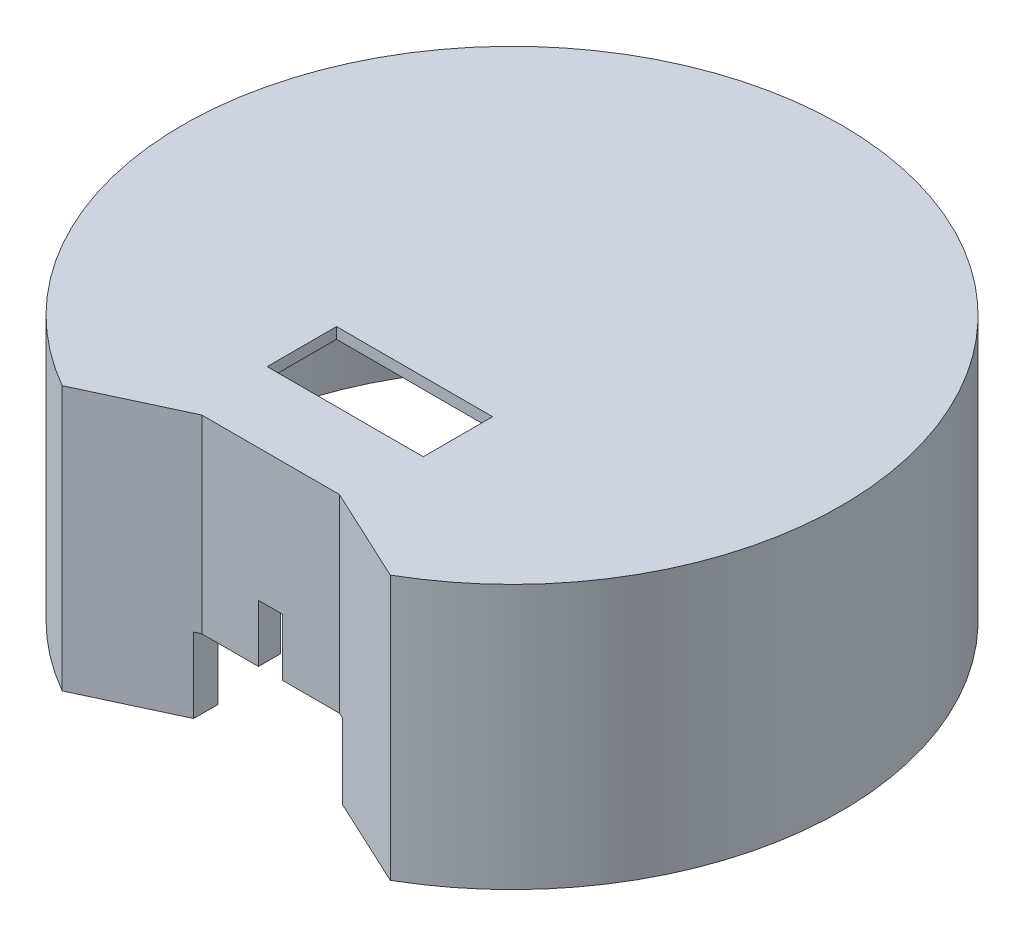
ISO-10303-21;
HEADER;
FILE_DESCRIPTION(('STEP AP214'),'2;1');
FILE_NAME('part.step','',(''),(''),'','','');
FILE_SCHEMA(('AUTOMOTIVE_DESIGN { 1 0 10303 214 1 1 1 1 }'));
ENDSEC;
DATA;
#1=APPLICATION_CONTEXT('core data for automotive mechanical design processes');
#2=APPLICATION_PROTOCOL_DEFINITION('international standard','automotive_design',2000,#1);
#3=PRODUCT_CONTEXT('',#1,'mechanical');
#4=PRODUCT('Part','Part','',(#3));
#5=PRODUCT_RELATED_PRODUCT_CATEGORY('part','',(#4));
#6=PRODUCT_DEFINITION_FORMATION('','',#4);
#7=PRODUCT_DEFINITION_CONTEXT('part definition',#1,'design');
#8=PRODUCT_DEFINITION('design','',#6,#7);
#9=PRODUCT_DEFINITION_SHAPE('','',#8);
#10=(LENGTH_UNIT() NAMED_UNIT(*) SI_UNIT(.MILLI.,.METRE.));
#11=(NAMED_UNIT(*) PLANE_ANGLE_UNIT() SI_UNIT($,.RADIAN.));
#12=(NAMED_UNIT(*) SI_UNIT($,.STERADIAN.) SOLID_ANGLE_UNIT());
#13=UNCERTAINTY_MEASURE_WITH_UNIT(LENGTH_MEASURE(1.E-05),#10,'distance_accuracy_value','');
#14=(GEOMETRIC_REPRESENTATION_CONTEXT(3) GLOBAL_UNCERTAINTY_ASSIGNED_CONTEXT((#13)) GLOBAL_UNIT_ASSIGNED_CONTEXT((#10,
#11,#12)) REPRESENTATION_CONTEXT('',''));
#15=CARTESIAN_POINT('',(0.,0.,0.));
#16=DIRECTION('',(0.,0.,1.));
#17=DIRECTION('',(1.,0.,0.));
#18=AXIS2_PLACEMENT_3D('',#15,#16,#17);
#19=CARTESIAN_POINT('',(-45.,0.,96.2));
#20=DIRECTION('',(-1.,0.,0.));
#21=DIRECTION('',(0.,0.,1.));
#22=AXIS2_PLACEMENT_3D('',#19,#20,#21);
#23=PLANE('',#22);
#24=DIRECTION('',(0.,0.,1.));
#25=VECTOR('',#24,1.);
#26=CARTESIAN_POINT('',(-45.,146.05,0.));
#27=LINE('',#26,#25);
#28=CARTESIAN_POINT('',(-45.,146.05,56.2));
#29=VERTEX_POINT('',#28);
#30=CARTESIAN_POINT('',(-45.,146.05,96.2));
#31=VERTEX_POINT('',#30);
#32=EDGE_CURVE('E54',#29,#31,#27,.T.);
#33=ORIENTED_EDGE('',*,*,#32,.F.);
#34=DIRECTION('',(0.,1.,0.));
#35=VECTOR('',#34,1.);
#36=CARTESIAN_POINT('',(-45.,0.,56.2));
#37=LINE('',#36,#35);
#38=CARTESIAN_POINT('',(-45.,152.4,56.2));
#39=VERTEX_POINT('',#38);
#40=EDGE_CURVE('E241',#29,#39,#37,.T.);
#41=ORIENTED_EDGE('',*,*,#40,.T.);
#42=DIRECTION('',(0.,0.,-1.));
#43=VECTOR('',#42,1.);
#44=CARTESIAN_POINT('',(-45.,152.4,0.));
#45=LINE('',#44,#43);
#46=CARTESIAN_POINT('',(-45.,152.4,96.2));
#47=VERTEX_POINT('',#46);
#48=EDGE_CURVE('E257',#47,#39,#45,.T.);
#49=ORIENTED_EDGE('',*,*,#48,.F.);
#50=DIRECTION('',(0.,1.,0.));
#51=VECTOR('',#50,1.);
#52=CARTESIAN_POINT('',(-45.,0.,96.2));
#53=LINE('',#52,#51);
#54=EDGE_CURVE('E234',#31,#47,#53,.T.);
#55=ORIENTED_EDGE('',*,*,#54,.F.);
#56=EDGE_LOOP('',(#33,#41,#49,#55));
#57=FACE_BOUND('',#56,.T.);
#58=ADVANCED_FACE('F39',(#57),#23,.F.);
#59=CARTESIAN_POINT('',(-45.,0.,56.2));
#60=DIRECTION('',(0.,0.,-1.));
#61=DIRECTION('',(-1.,0.,0.));
#62=AXIS2_PLACEMENT_3D('',#59,#60,#61);
#63=PLANE('',#62);
#64=DIRECTION('',(-1.,0.,0.));
#65=VECTOR('',#64,1.);
#66=CARTESIAN_POINT('',(0.,146.05,56.2));
#67=LINE('',#66,#65);
#68=CARTESIAN_POINT('',(45.,146.05,56.2));
#69=VERTEX_POINT('',#68);
#70=EDGE_CURVE('E211',#69,#29,#67,.T.);
#71=ORIENTED_EDGE('',*,*,#70,.F.);
#72=DIRECTION('',(0.,1.,0.));
#73=VECTOR('',#72,1.);
#74=CARTESIAN_POINT('',(45.,0.,56.2));
#75=LINE('',#74,#73);
#76=CARTESIAN_POINT('',(45.,152.4,56.2));
#77=VERTEX_POINT('',#76);
#78=EDGE_CURVE('E244',#69,#77,#75,.T.);
#79=ORIENTED_EDGE('',*,*,#78,.T.);
#80=DIRECTION('',(1.,0.,0.));
#81=VECTOR('',#80,1.);
#82=CARTESIAN_POINT('',(0.,152.4,56.2));
#83=LINE('',#82,#81);
#84=EDGE_CURVE('E254',#39,#77,#83,.T.);
#85=ORIENTED_EDGE('',*,*,#84,.F.);
#86=ORIENTED_EDGE('',*,*,#40,.F.);
#87=EDGE_LOOP('',(#71,#79,#85,#86));
#88=FACE_BOUND('',#87,.T.);
#89=ADVANCED_FACE('F377',(#88),#63,.F.);
#90=CARTESIAN_POINT('',(45.,0.,96.2));
#91=DIRECTION('',(1.,0.,0.));
#92=DIRECTION('',(0.,0.,-1.));
#93=AXIS2_PLACEMENT_3D('',#90,#91,#92);
#94=PLANE('',#93);
#95=DIRECTION('',(0.,0.,-1.));
#96=VECTOR('',#95,1.);
#97=CARTESIAN_POINT('',(45.,146.05,0.));
#98=LINE('',#97,#96);
#99=CARTESIAN_POINT('',(45.,146.05,96.2));
#100=VERTEX_POINT('',#99);
#101=EDGE_CURVE('E216',#100,#69,#98,.T.);
#102=ORIENTED_EDGE('',*,*,#101,.F.);
#103=DIRECTION('',(0.,1.,0.));
#104=VECTOR('',#103,1.);
#105=CARTESIAN_POINT('',(45.,0.,96.2));
#106=LINE('',#105,#104);
#107=CARTESIAN_POINT('',(45.,152.4,96.2));
#108=VERTEX_POINT('',#107);
#109=EDGE_CURVE('E246',#100,#108,#106,.T.);
#110=ORIENTED_EDGE('',*,*,#109,.T.);
#111=DIRECTION('',(0.,0.,1.));
#112=VECTOR('',#111,1.);
#113=CARTESIAN_POINT('',(45.,152.4,0.));
#114=LINE('',#113,#112);
#115=EDGE_CURVE('E251',#77,#108,#114,.T.);
#116=ORIENTED_EDGE('',*,*,#115,.F.);
#117=ORIENTED_EDGE('',*,*,#78,.F.);
#118=EDGE_LOOP('',(#102,#110,#116,#117));
#119=FACE_BOUND('',#118,.T.);
#120=ADVANCED_FACE('F383',(#119),#94,.F.);
#121=CARTESIAN_POINT('',(-45.,0.,96.2));
#122=DIRECTION('',(0.,0.,1.));
#123=DIRECTION('',(1.,0.,0.));
#124=AXIS2_PLACEMENT_3D('',#121,#122,#123);
#125=PLANE('',#124);
#126=DIRECTION('',(1.,0.,0.));
#127=VECTOR('',#126,1.);
#128=CARTESIAN_POINT('',(0.,146.05,96.2));
#129=LINE('',#128,#127);
#130=EDGE_CURVE('E214',#31,#100,#129,.T.);
#131=ORIENTED_EDGE('',*,*,#130,.F.);
#132=ORIENTED_EDGE('',*,*,#54,.T.);
#133=DIRECTION('',(-1.,0.,0.));
#134=VECTOR('',#133,1.);
#135=CARTESIAN_POINT('',(0.,152.4,96.2));
#136=LINE('',#135,#134);
#137=EDGE_CURVE('E243',#108,#47,#136,.T.);
#138=ORIENTED_EDGE('',*,*,#137,.F.);
#139=ORIENTED_EDGE('',*,*,#109,.F.);
#140=EDGE_LOOP('',(#131,#132,#138,#139));
#141=FACE_BOUND('',#140,.T.);
#142=ADVANCED_FACE('F388',(#141),#125,.F.);
#143=CARTESIAN_POINT('',(-39.6875000000003,152.4,139.2));
#144=DIRECTION('',(0.,0.,-1.));
#145=DIRECTION('',(-1.,0.,0.));
#146=AXIS2_PLACEMENT_3D('',#143,#144,#145);
#147=PLANE('',#146);
#148=DIRECTION('',(0.,-1.,0.));
#149=VECTOR('',#148,1.);
#150=CARTESIAN_POINT('',(6.98499999999998,0.,139.2));
#151=LINE('',#150,#149);
#152=CARTESIAN_POINT('',(6.985,76.2,139.2));
#153=VERTEX_POINT('',#152);
#154=CARTESIAN_POINT('',(6.98499999999999,43.175,139.2));
#155=VERTEX_POINT('',#154);
#156=EDGE_CURVE('E225',#153,#155,#151,.T.);
#157=ORIENTED_EDGE('',*,*,#156,.T.);
#158=DIRECTION('',(-1.,0.,0.));
#159=VECTOR('',#158,1.);
#160=CARTESIAN_POINT('',(39.6874999999997,43.175,139.2));
#161=LINE('',#160,#159);
#162=CARTESIAN_POINT('',(39.6874999999997,43.175,139.2));
#163=VERTEX_POINT('',#162);
#164=EDGE_CURVE('E275',#163,#155,#161,.T.);
#165=ORIENTED_EDGE('',*,*,#164,.F.);
#166=DIRECTION('',(0.,-1.,0.));
#167=VECTOR('',#166,1.);
#168=CARTESIAN_POINT('',(39.6874999999997,152.4,139.2));
#169=LINE('',#168,#167);
#170=CARTESIAN_POINT('',(39.6874999999997,152.4,139.2));
#171=VERTEX_POINT('',#170);
#172=EDGE_CURVE('E47',#171,#163,#169,.T.);
#173=ORIENTED_EDGE('',*,*,#172,.F.);
#174=DIRECTION('',(1.,0.,0.));
#175=VECTOR('',#174,1.);
#176=CARTESIAN_POINT('',(-39.6875000000003,152.4,139.2));
#177=LINE('',#176,#175);
#178=CARTESIAN_POINT('',(-39.6875000000003,152.4,139.2));
#179=VERTEX_POINT('',#178);
#180=EDGE_CURVE('E310',#179,#171,#177,.T.);
#181=ORIENTED_EDGE('',*,*,#180,.F.);
#182=DIRECTION('',(0.,-1.,0.));
#183=VECTOR('',#182,1.);
#184=CARTESIAN_POINT('',(-39.6875000000003,152.4,139.2));
#185=LINE('',#184,#183);
#186=CARTESIAN_POINT('',(-39.6875000000003,43.175,139.2));
#187=VERTEX_POINT('',#186);
#188=EDGE_CURVE('E11',#179,#187,#185,.T.);
#189=ORIENTED_EDGE('',*,*,#188,.T.);
#190=CARTESIAN_POINT('',(-6.98499999999998,43.175,139.2));
#191=VERTEX_POINT('',#190);
#192=EDGE_CURVE('E274',#191,#187,#161,.T.);
#193=ORIENTED_EDGE('',*,*,#192,.F.);
#194=DIRECTION('',(0.,-1.,0.));
#195=VECTOR('',#194,1.);
#196=CARTESIAN_POINT('',(-6.98499999999998,0.,139.2));
#197=LINE('',#196,#195);
#198=CARTESIAN_POINT('',(-6.985,76.2,139.2));
#199=VERTEX_POINT('',#198);
#200=EDGE_CURVE('E62',#199,#191,#197,.T.);
#201=ORIENTED_EDGE('',*,*,#200,.F.);
#202=DIRECTION('',(1.,0.,0.));
#203=VECTOR('',#202,1.);
#204=CARTESIAN_POINT('',(0.,76.2,139.2));
#205=LINE('',#204,#203);
#206=EDGE_CURVE('E221',#199,#153,#205,.T.);
#207=ORIENTED_EDGE('',*,*,#206,.T.);
#208=EDGE_LOOP('',(#157,#165,#173,#181,#189,#193,#201,#207));
#209=FACE_BOUND('',#208,.T.);
#210=ADVANCED_FACE('F336',(#209),#147,.F.);
#211=CARTESIAN_POINT('',(-39.6875000000003,152.4,126.5));
#212=DIRECTION('',(0.,0.,-1.));
#213=DIRECTION('',(-1.,0.,0.));
#214=AXIS2_PLACEMENT_3D('',#211,#212,#213);
#215=PLANE('',#214);
#216=DIRECTION('',(1.,0.,0.));
#217=VECTOR('',#216,1.);
#218=CARTESIAN_POINT('',(-42.5030222155656,43.175,126.5));
#219=LINE('',#218,#217);
#220=CARTESIAN_POINT('',(6.98499999999999,43.175,126.5));
#221=VERTEX_POINT('',#220);
#222=CARTESIAN_POINT('',(42.5030222155651,43.175,126.5));
#223=VERTEX_POINT('',#222);
#224=EDGE_CURVE('E263',#221,#223,#219,.T.);
#225=ORIENTED_EDGE('',*,*,#224,.F.);
#226=DIRECTION('',(0.,-1.,0.));
#227=VECTOR('',#226,1.);
#228=CARTESIAN_POINT('',(6.98499999999998,0.,126.5));
#229=LINE('',#228,#227);
#230=CARTESIAN_POINT('',(6.985,76.2,126.5));
#231=VERTEX_POINT('',#230);
#232=EDGE_CURVE('E232',#231,#221,#229,.T.);
#233=ORIENTED_EDGE('',*,*,#232,.F.);
#234=DIRECTION('',(1.,0.,0.));
#235=VECTOR('',#234,1.);
#236=CARTESIAN_POINT('',(0.,76.2,126.5));
#237=LINE('',#236,#235);
#238=CARTESIAN_POINT('',(-6.985,76.2,126.5));
#239=VERTEX_POINT('',#238);
#240=EDGE_CURVE('E220',#239,#231,#237,.T.);
#241=ORIENTED_EDGE('',*,*,#240,.F.);
#242=DIRECTION('',(0.,-1.,0.));
#243=VECTOR('',#242,1.);
#244=CARTESIAN_POINT('',(-6.98499999999998,0.,126.5));
#245=LINE('',#244,#243);
#246=CARTESIAN_POINT('',(-6.985,43.175,126.5));
#247=VERTEX_POINT('',#246);
#248=EDGE_CURVE('E229',#239,#247,#245,.T.);
#249=ORIENTED_EDGE('',*,*,#248,.T.);
#250=CARTESIAN_POINT('',(-42.5030222155656,43.175,126.5));
#251=VERTEX_POINT('',#250);
#252=EDGE_CURVE('E187',#251,#247,#219,.T.);
#253=ORIENTED_EDGE('',*,*,#252,.F.);
#254=DIRECTION('',(0.,-1.,0.));
#255=VECTOR('',#254,1.);
#256=CARTESIAN_POINT('',(-42.5030222155656,152.4,126.5));
#257=LINE('',#256,#255);
#258=CARTESIAN_POINT('',(-42.5030222155656,146.05,126.5));
#259=VERTEX_POINT('',#258);
#260=EDGE_CURVE('E177',#259,#251,#257,.T.);
#261=ORIENTED_EDGE('',*,*,#260,.F.);
#262=DIRECTION('',(-1.,0.,0.));
#263=VECTOR('',#262,1.);
#264=CARTESIAN_POINT('',(0.,146.05,126.5));
#265=LINE('',#264,#263);
#266=CARTESIAN_POINT('',(42.5030222155651,146.05,126.5));
#267=VERTEX_POINT('',#266);
#268=EDGE_CURVE('E183',#267,#259,#265,.T.);
#269=ORIENTED_EDGE('',*,*,#268,.F.);
#270=DIRECTION('',(0.,-1.,0.));
#271=VECTOR('',#270,1.);
#272=CARTESIAN_POINT('',(42.5030222155651,152.4,126.5));
#273=LINE('',#272,#271);
#274=EDGE_CURVE('E191',#267,#223,#273,.T.);
#275=ORIENTED_EDGE('',*,*,#274,.T.);
#276=EDGE_LOOP('',(#225,#233,#241,#249,#253,#261,#269,#275));
#277=FACE_BOUND('',#276,.T.);
#278=ADVANCED_FACE('F180',(#277),#215,.T.);
#279=CARTESIAN_POINT('',(0.,43.175,0.));
#280=DIRECTION('',(0.,1.,0.));
#281=DIRECTION('',(0.,0.,1.));
#282=AXIS2_PLACEMENT_3D('',#279,#280,#281);
#283=PLANE('',#282);
#284=DIRECTION('',(0.,0.,1.));
#285=VECTOR('',#284,1.);
#286=CARTESIAN_POINT('',(6.98499999999999,43.175,90.6417858085487));
#287=LINE('',#286,#285);
#288=EDGE_CURVE('E228',#221,#155,#287,.T.);
#289=ORIENTED_EDGE('',*,*,#288,.F.);
#290=ORIENTED_EDGE('',*,*,#224,.T.);
#291=DIRECTION('',(0.906307787036655,0.,0.42261826174069));
#292=VECTOR('',#291,1.);
#293=CARTESIAN_POINT('',(42.5030222155651,43.175,126.5));
#294=LINE('',#293,#292);
#295=CARTESIAN_POINT('',(42.8624999999997,43.175,126.667627243818));
#296=VERTEX_POINT('',#295);
#297=EDGE_CURVE('E266',#223,#296,#294,.T.);
#298=ORIENTED_EDGE('',*,*,#297,.T.);
#299=DIRECTION('',(0.,0.,1.));
#300=VECTOR('',#299,1.);
#301=CARTESIAN_POINT('',(42.8624999999997,43.175,140.680526814642));
#302=LINE('',#301,#300);
#303=CARTESIAN_POINT('',(42.8624999999997,43.175,140.680526814642));
#304=VERTEX_POINT('',#303);
#305=EDGE_CURVE('E269',#296,#304,#302,.T.);
#306=ORIENTED_EDGE('',*,*,#305,.T.);
#307=DIRECTION('',(-0.90630778703665,0.,-0.422618261740699));
#308=VECTOR('',#307,1.);
#309=CARTESIAN_POINT('',(42.8624999999997,43.175,140.680526814642));
#310=LINE('',#309,#308);
#311=EDGE_CURVE('E272',#304,#163,#310,.T.);
#312=ORIENTED_EDGE('',*,*,#311,.T.);
#313=ORIENTED_EDGE('',*,*,#164,.T.);
#314=EDGE_LOOP('',(#289,#290,#298,#306,#312,#313));
#315=FACE_BOUND('',#314,.T.);
#316=ADVANCED_FACE('F340',(#315),#283,.F.);
#317=CARTESIAN_POINT('',(0.,0.,0.));
#318=DIRECTION('',(0.,-1.,0.));
#319=DIRECTION('',(0.,0.,-1.));
#320=AXIS2_PLACEMENT_3D('',#317,#318,#319);
#321=PLANE('',#320);
#322=DIRECTION('',(0.,0.,-1.));
#323=VECTOR('',#322,1.);
#324=CARTESIAN_POINT('',(-42.8625000000003,0.,126.667627243818));
#325=LINE('',#324,#323);
#326=CARTESIAN_POINT('',(-42.8625000000003,0.,140.680526814642));
#327=VERTEX_POINT('',#326);
#328=CARTESIAN_POINT('',(-42.8625000000003,0.,126.667627243818));
#329=VERTEX_POINT('',#328);
#330=EDGE_CURVE('E264',#327,#329,#325,.T.);
#331=ORIENTED_EDGE('',*,*,#330,.F.);
#332=DIRECTION('',(0.906307787036653,0.,-0.422618261740694));
#333=VECTOR('',#332,1.);
#334=CARTESIAN_POINT('',(-39.6875000000003,0.,139.2));
#335=LINE('',#334,#333);
#336=CARTESIAN_POINT('',(-94.5702011913656,0.,164.792223865766));
#337=VERTEX_POINT('',#336);
#338=EDGE_CURVE('E190',#337,#327,#335,.T.);
#339=ORIENTED_EDGE('',*,*,#338,.F.);
#340=CARTESIAN_POINT('',(0.,0.,0.));
#341=DIRECTION('',(0.,1.,0.));
#342=DIRECTION('',(0.,0.,-1.));
#343=AXIS2_PLACEMENT_3D('',#340,#341,#342);
#344=CIRCLE('',#343,190.);
#345=CARTESIAN_POINT('',(94.5702011913649,0.,164.792223865766));
#346=VERTEX_POINT('',#345);
#347=EDGE_CURVE('E311',#346,#337,#344,.T.);
#348=ORIENTED_EDGE('',*,*,#347,.F.);
#349=DIRECTION('',(0.90630778703665,0.,0.4226182617407));
#350=VECTOR('',#349,1.);
#351=CARTESIAN_POINT('',(39.6874999999997,0.,139.2));
#352=LINE('',#351,#350);
#353=CARTESIAN_POINT('',(42.8624999999997,0.,140.680526814642));
#354=VERTEX_POINT('',#353);
#355=EDGE_CURVE('E320',#354,#346,#352,.T.);
#356=ORIENTED_EDGE('',*,*,#355,.F.);
#357=DIRECTION('',(0.,0.,1.));
#358=VECTOR('',#357,1.);
#359=CARTESIAN_POINT('',(42.8624999999997,0.,140.680526814642));
#360=LINE('',#359,#358);
#361=CARTESIAN_POINT('',(42.8624999999997,0.,126.667627243818));
#362=VERTEX_POINT('',#361);
#363=EDGE_CURVE('E260',#362,#354,#360,.T.);
#364=ORIENTED_EDGE('',*,*,#363,.F.);
#365=DIRECTION('',(0.90630778703665,0.,0.4226182617407));
#366=VECTOR('',#365,1.);
#367=CARTESIAN_POINT('',(-40.8610079466913,0.,87.6267143206755));
#368=LINE('',#367,#366);
#369=CARTESIAN_POINT('',(93.8323898009871,0.,150.435277193335));
#370=VERTEX_POINT('',#369);
#371=EDGE_CURVE('E303',#362,#370,#368,.T.);
#372=ORIENTED_EDGE('',*,*,#371,.T.);
#373=CARTESIAN_POINT('',(0.,0.,0.));
#374=DIRECTION('',(0.,-1.,0.));
#375=DIRECTION('',(0.,0.,-1.));
#376=AXIS2_PLACEMENT_3D('',#373,#374,#375);
#377=CIRCLE('',#376,177.3);
#378=CARTESIAN_POINT('',(-93.8323898009877,0.,150.435277193335));
#379=VERTEX_POINT('',#378);
#380=EDGE_CURVE('E297',#370,#379,#377,.F.);
#381=ORIENTED_EDGE('',*,*,#380,.T.);
#382=DIRECTION('',(0.906307787036653,0.,-0.422618261740694));
#383=VECTOR('',#382,1.);
#384=CARTESIAN_POINT('',(40.8610079466909,0.,87.6267143206761));
#385=LINE('',#384,#383);
#386=EDGE_CURVE('E288',#379,#329,#385,.T.);
#387=ORIENTED_EDGE('',*,*,#386,.T.);
#388=EDGE_LOOP('',(#331,#339,#348,#356,#364,#372,#381,#387));
#389=FACE_BOUND('',#388,.T.);
#390=ADVANCED_FACE('F350',(#389),#321,.T.);
#391=CARTESIAN_POINT('',(-39.6875000000003,152.4,139.2));
#392=DIRECTION('',(-0.422618261740694,0.,-0.906307787036652));
#393=DIRECTION('',(-0.906307787036653,0.,0.422618261740694));
#394=AXIS2_PLACEMENT_3D('',#391,#392,#393);
#395=PLANE('',#394);
#396=ORIENTED_EDGE('',*,*,#338,.T.);
#397=DIRECTION('',(0.,-1.,0.));
#398=VECTOR('',#397,1.);
#399=CARTESIAN_POINT('',(-42.8625000000003,43.175,140.680526814642));
#400=LINE('',#399,#398);
#401=CARTESIAN_POINT('',(-42.8625000000003,43.175,140.680526814642));
#402=VERTEX_POINT('',#401);
#403=EDGE_CURVE('E289',#402,#327,#400,.T.);
#404=ORIENTED_EDGE('',*,*,#403,.F.);
#405=DIRECTION('',(-0.906307787036651,0.,0.422618261740697));
#406=VECTOR('',#405,1.);
#407=CARTESIAN_POINT('',(-42.8625000000003,43.175,140.680526814642));
#408=LINE('',#407,#406);
#409=EDGE_CURVE('E278',#187,#402,#408,.T.);
#410=ORIENTED_EDGE('',*,*,#409,.F.);
#411=ORIENTED_EDGE('',*,*,#188,.F.);
#412=DIRECTION('',(0.906307787036653,0.,-0.422618261740694));
#413=VECTOR('',#412,1.);
#414=CARTESIAN_POINT('',(-39.6875000000003,152.4,139.2));
#415=LINE('',#414,#413);
#416=CARTESIAN_POINT('',(-94.5702011913656,152.4,164.792223865766));
#417=VERTEX_POINT('',#416);
#418=EDGE_CURVE('E307',#417,#179,#415,.T.);
#419=ORIENTED_EDGE('',*,*,#418,.F.);
#420=DIRECTION('',(0.,-1.,0.));
#421=VECTOR('',#420,1.);
#422=CARTESIAN_POINT('',(-94.5702011913656,152.4,164.792223865766));
#423=LINE('',#422,#421);
#424=EDGE_CURVE('E317',#417,#337,#423,.T.);
#425=ORIENTED_EDGE('',*,*,#424,.T.);
#426=EDGE_LOOP('',(#396,#404,#410,#411,#419,#425));
#427=FACE_BOUND('',#426,.T.);
#428=ADVANCED_FACE('F41',(#427),#395,.F.);
#429=CARTESIAN_POINT('',(39.6874999999997,152.4,139.2));
#430=DIRECTION('',(0.4226182617407,0.,-0.90630778703665));
#431=DIRECTION('',(-0.90630778703665,0.,-0.4226182617407));
#432=AXIS2_PLACEMENT_3D('',#429,#430,#431);
#433=PLANE('',#432);
#434=ORIENTED_EDGE('',*,*,#311,.F.);
#435=DIRECTION('',(0.,-1.,0.));
#436=VECTOR('',#435,1.);
#437=CARTESIAN_POINT('',(42.8624999999997,43.175,140.680526814642));
#438=LINE('',#437,#436);
#439=EDGE_CURVE('E291',#304,#354,#438,.T.);
#440=ORIENTED_EDGE('',*,*,#439,.T.);
#441=ORIENTED_EDGE('',*,*,#355,.T.);
#442=DIRECTION('',(0.,-1.,0.));
#443=VECTOR('',#442,1.);
#444=CARTESIAN_POINT('',(94.5702011913649,152.4,164.792223865766));
#445=LINE('',#444,#443);
#446=CARTESIAN_POINT('',(94.5702011913649,152.4,164.792223865766));
#447=VERTEX_POINT('',#446);
#448=EDGE_CURVE('E325',#447,#346,#445,.T.);
#449=ORIENTED_EDGE('',*,*,#448,.F.);
#450=DIRECTION('',(0.90630778703665,0.,0.4226182617407));
#451=VECTOR('',#450,1.);
#452=CARTESIAN_POINT('',(39.6874999999997,152.4,139.2));
#453=LINE('',#452,#451);
#454=EDGE_CURVE('E313',#171,#447,#453,.T.);
#455=ORIENTED_EDGE('',*,*,#454,.F.);
#456=ORIENTED_EDGE('',*,*,#172,.T.);
#457=EDGE_LOOP('',(#434,#440,#441,#449,#455,#456));
#458=FACE_BOUND('',#457,.T.);
#459=ADVANCED_FACE('F332',(#458),#433,.F.);
#460=CARTESIAN_POINT('',(0.,152.4,0.));
#461=DIRECTION('',(0.,-1.,0.));
#462=DIRECTION('',(0.,0.,-1.));
#463=AXIS2_PLACEMENT_3D('',#460,#461,#462);
#464=CYLINDRICAL_SURFACE('',#463,190.);
#465=ORIENTED_EDGE('',*,*,#347,.T.);
#466=ORIENTED_EDGE('',*,*,#424,.F.);
#467=CARTESIAN_POINT('',(0.,152.4,0.));
#468=DIRECTION('',(0.,1.,0.));
#469=DIRECTION('',(0.,0.,-1.));
#470=AXIS2_PLACEMENT_3D('',#467,#468,#469);
#471=CIRCLE('',#470,190.);
#472=EDGE_CURVE('E315',#447,#417,#471,.T.);
#473=ORIENTED_EDGE('',*,*,#472,.F.);
#474=ORIENTED_EDGE('',*,*,#448,.T.);
#475=EDGE_LOOP('',(#465,#466,#473,#474));
#476=FACE_BOUND('',#475,.T.);
#477=ADVANCED_FACE('F355',(#476),#464,.T.);
#478=CARTESIAN_POINT('',(0.,152.4,0.));
#479=DIRECTION('',(0.,-1.,0.));
#480=DIRECTION('',(0.,0.,-1.));
#481=AXIS2_PLACEMENT_3D('',#478,#479,#480);
#482=PLANE('',#481);
#483=ORIENTED_EDGE('',*,*,#137,.T.);
#484=ORIENTED_EDGE('',*,*,#48,.T.);
#485=ORIENTED_EDGE('',*,*,#84,.T.);
#486=ORIENTED_EDGE('',*,*,#115,.T.);
#487=EDGE_LOOP('',(#483,#484,#485,#486));
#488=FACE_BOUND('',#487,.T.);
#489=ORIENTED_EDGE('',*,*,#418,.T.);
#490=ORIENTED_EDGE('',*,*,#180,.T.);
#491=ORIENTED_EDGE('',*,*,#454,.T.);
#492=ORIENTED_EDGE('',*,*,#472,.T.);
#493=EDGE_LOOP('',(#489,#490,#491,#492));
#494=FACE_BOUND('',#493,.T.);
#495=ADVANCED_FACE('F363',(#488,#494),#482,.F.);
#496=CARTESIAN_POINT('',(-45.0547519241071,152.4,127.689891104634));
#497=DIRECTION('',(-0.422618261740694,0.,-0.906307787036652));
#498=DIRECTION('',(-0.906307787036653,0.,0.422618261740694));
#499=AXIS2_PLACEMENT_3D('',#496,#497,#498);
#500=PLANE('',#499);
#501=DIRECTION('',(0.,-1.,0.));
#502=VECTOR('',#501,1.);
#503=CARTESIAN_POINT('',(-42.8625000000003,43.175,126.667627243818));
#504=LINE('',#503,#502);
#505=CARTESIAN_POINT('',(-42.8625000000003,43.175,126.667627243818));
#506=VERTEX_POINT('',#505);
#507=EDGE_CURVE('E286',#506,#329,#504,.T.);
#508=ORIENTED_EDGE('',*,*,#507,.T.);
#509=ORIENTED_EDGE('',*,*,#386,.F.);
#510=DIRECTION('',(0.,-1.,0.));
#511=VECTOR('',#510,1.);
#512=CARTESIAN_POINT('',(-93.8323898009877,139.7,150.435277193335));
#513=LINE('',#512,#511);
#514=CARTESIAN_POINT('',(-93.8323898009876,146.05,150.435277193335));
#515=VERTEX_POINT('',#514);
#516=EDGE_CURVE('E198',#515,#379,#513,.T.);
#517=ORIENTED_EDGE('',*,*,#516,.F.);
#518=DIRECTION('',(-0.906307787036653,0.,0.422618261740694));
#519=VECTOR('',#518,1.);
#520=CARTESIAN_POINT('',(40.8610079466909,146.05,87.6267143206761));
#521=LINE('',#520,#519);
#522=EDGE_CURVE('E194',#259,#515,#521,.T.);
#523=ORIENTED_EDGE('',*,*,#522,.F.);
#524=ORIENTED_EDGE('',*,*,#260,.T.);
#525=DIRECTION('',(0.906307787036658,0.,-0.422618261740683));
#526=VECTOR('',#525,1.);
#527=CARTESIAN_POINT('',(-42.5030222155656,43.175,126.5));
#528=LINE('',#527,#526);
#529=EDGE_CURVE('E261',#506,#251,#528,.T.);
#530=ORIENTED_EDGE('',*,*,#529,.F.);
#531=EDGE_LOOP('',(#508,#509,#517,#523,#524,#530));
#532=FACE_BOUND('',#531,.T.);
#533=ADVANCED_FACE('F196',(#532),#500,.T.);
#534=CARTESIAN_POINT('',(45.0547519241066,152.4,127.689891104635));
#535=DIRECTION('',(0.4226182617407,0.,-0.90630778703665));
#536=DIRECTION('',(-0.90630778703665,0.,-0.4226182617407));
#537=AXIS2_PLACEMENT_3D('',#534,#535,#536);
#538=PLANE('',#537);
#539=DIRECTION('',(0.,-1.,0.));
#540=VECTOR('',#539,1.);
#541=CARTESIAN_POINT('',(42.8624999999997,43.175,126.667627243818));
#542=LINE('',#541,#540);
#543=EDGE_CURVE('E283',#296,#362,#542,.T.);
#544=ORIENTED_EDGE('',*,*,#543,.F.);
#545=ORIENTED_EDGE('',*,*,#297,.F.);
#546=ORIENTED_EDGE('',*,*,#274,.F.);
#547=DIRECTION('',(-0.90630778703665,0.,-0.4226182617407));
#548=VECTOR('',#547,1.);
#549=CARTESIAN_POINT('',(-40.8610079466913,146.05,87.6267143206755));
#550=LINE('',#549,#548);
#551=CARTESIAN_POINT('',(93.8323898009871,146.05,150.435277193335));
#552=VERTEX_POINT('',#551);
#553=EDGE_CURVE('E206',#552,#267,#550,.T.);
#554=ORIENTED_EDGE('',*,*,#553,.F.);
#555=DIRECTION('',(0.,-1.,0.));
#556=VECTOR('',#555,1.);
#557=CARTESIAN_POINT('',(93.8323898009871,139.7,150.435277193335));
#558=LINE('',#557,#556);
#559=EDGE_CURVE('E296',#552,#370,#558,.T.);
#560=ORIENTED_EDGE('',*,*,#559,.T.);
#561=ORIENTED_EDGE('',*,*,#371,.F.);
#562=EDGE_LOOP('',(#544,#545,#546,#554,#560,#561));
#563=FACE_BOUND('',#562,.T.);
#564=ADVANCED_FACE('F371',(#563),#538,.T.);
#565=CARTESIAN_POINT('',(0.,152.4,0.));
#566=DIRECTION('',(0.,-1.,0.));
#567=DIRECTION('',(0.,0.,-1.));
#568=AXIS2_PLACEMENT_3D('',#565,#566,#567);
#569=CYLINDRICAL_SURFACE('',#568,177.3);
#570=ORIENTED_EDGE('',*,*,#380,.F.);
#571=ORIENTED_EDGE('',*,*,#559,.F.);
#572=CARTESIAN_POINT('',(0.,146.05,0.));
#573=DIRECTION('',(0.,-1.,0.));
#574=DIRECTION('',(0.,0.,-1.));
#575=AXIS2_PLACEMENT_3D('',#572,#573,#574);
#576=CIRCLE('',#575,177.3);
#577=EDGE_CURVE('E202',#515,#552,#576,.T.);
#578=ORIENTED_EDGE('',*,*,#577,.F.);
#579=ORIENTED_EDGE('',*,*,#516,.T.);
#580=EDGE_LOOP('',(#570,#571,#578,#579));
#581=FACE_BOUND('',#580,.T.);
#582=ADVANCED_FACE('F398',(#581),#569,.F.);
#583=CARTESIAN_POINT('',(-42.8625000000003,43.175,126.667627243818));
#584=DIRECTION('',(-1.,0.,0.));
#585=DIRECTION('',(0.,0.,1.));
#586=AXIS2_PLACEMENT_3D('',#583,#584,#585);
#587=PLANE('',#586);
#588=ORIENTED_EDGE('',*,*,#330,.T.);
#589=ORIENTED_EDGE('',*,*,#507,.F.);
#590=DIRECTION('',(0.,0.,-1.));
#591=VECTOR('',#590,1.);
#592=CARTESIAN_POINT('',(-42.8625000000003,43.175,126.667627243818));
#593=LINE('',#592,#591);
#594=EDGE_CURVE('E280',#402,#506,#593,.T.);
#595=ORIENTED_EDGE('',*,*,#594,.F.);
#596=ORIENTED_EDGE('',*,*,#403,.T.);
#597=EDGE_LOOP('',(#588,#589,#595,#596));
#598=FACE_BOUND('',#597,.T.);
#599=ADVANCED_FACE('F395',(#598),#587,.F.);
#600=CARTESIAN_POINT('',(42.8624999999997,43.175,140.680526814642));
#601=DIRECTION('',(1.,0.,0.));
#602=DIRECTION('',(0.,0.,-1.));
#603=AXIS2_PLACEMENT_3D('',#600,#601,#602);
#604=PLANE('',#603);
#605=ORIENTED_EDGE('',*,*,#363,.T.);
#606=ORIENTED_EDGE('',*,*,#439,.F.);
#607=ORIENTED_EDGE('',*,*,#305,.F.);
#608=ORIENTED_EDGE('',*,*,#543,.T.);
#609=EDGE_LOOP('',(#605,#606,#607,#608));
#610=FACE_BOUND('',#609,.T.);
#611=ADVANCED_FACE('F344',(#610),#604,.F.);
#612=ORIENTED_EDGE('',*,*,#252,.T.);
#613=DIRECTION('',(0.,0.,1.));
#614=VECTOR('',#613,1.);
#615=CARTESIAN_POINT('',(-6.985,43.175,90.6417858085487));
#616=LINE('',#615,#614);
#617=EDGE_CURVE('E231',#247,#191,#616,.T.);
#618=ORIENTED_EDGE('',*,*,#617,.T.);
#619=ORIENTED_EDGE('',*,*,#192,.T.);
#620=ORIENTED_EDGE('',*,*,#409,.T.);
#621=ORIENTED_EDGE('',*,*,#594,.T.);
#622=ORIENTED_EDGE('',*,*,#529,.T.);
#623=EDGE_LOOP('',(#612,#618,#619,#620,#621,#622));
#624=FACE_BOUND('',#623,.T.);
#625=ADVANCED_FACE('F390',(#624),#283,.F.);
#626=CARTESIAN_POINT('',(6.98499999999998,0.,90.6417858085487));
#627=DIRECTION('',(-1.,0.,0.));
#628=DIRECTION('',(0.,-1.,0.));
#629=AXIS2_PLACEMENT_3D('',#626,#627,#628);
#630=PLANE('',#629);
#631=ORIENTED_EDGE('',*,*,#232,.T.);
#632=ORIENTED_EDGE('',*,*,#288,.T.);
#633=ORIENTED_EDGE('',*,*,#156,.F.);
#634=DIRECTION('',(0.,0.,1.));
#635=VECTOR('',#634,1.);
#636=CARTESIAN_POINT('',(6.985,76.2,90.6417858085487));
#637=LINE('',#636,#635);
#638=EDGE_CURVE('E218',#231,#153,#637,.T.);
#639=ORIENTED_EDGE('',*,*,#638,.F.);
#640=EDGE_LOOP('',(#631,#632,#633,#639));
#641=FACE_BOUND('',#640,.T.);
#642=ADVANCED_FACE('F393',(#641),#630,.T.);
#643=CARTESIAN_POINT('',(-6.98499999999998,0.,90.6417858085487));
#644=DIRECTION('',(-1.,0.,0.));
#645=DIRECTION('',(0.,-1.,0.));
#646=AXIS2_PLACEMENT_3D('',#643,#644,#645);
#647=PLANE('',#646);
#648=DIRECTION('',(0.,0.,1.));
#649=VECTOR('',#648,1.);
#650=CARTESIAN_POINT('',(-6.985,76.2,90.6417858085487));
#651=LINE('',#650,#649);
#652=EDGE_CURVE('E224',#239,#199,#651,.T.);
#653=ORIENTED_EDGE('',*,*,#652,.T.);
#654=ORIENTED_EDGE('',*,*,#200,.T.);
#655=ORIENTED_EDGE('',*,*,#617,.F.);
#656=ORIENTED_EDGE('',*,*,#248,.F.);
#657=EDGE_LOOP('',(#653,#654,#655,#656));
#658=FACE_BOUND('',#657,.T.);
#659=ADVANCED_FACE('F418',(#658),#647,.F.);
#660=CARTESIAN_POINT('',(0.,76.2,90.6417858085487));
#661=DIRECTION('',(0.,-1.,0.));
#662=DIRECTION('',(0.,0.,-1.));
#663=AXIS2_PLACEMENT_3D('',#660,#661,#662);
#664=PLANE('',#663);
#665=ORIENTED_EDGE('',*,*,#240,.T.);
#666=ORIENTED_EDGE('',*,*,#638,.T.);
#667=ORIENTED_EDGE('',*,*,#206,.F.);
#668=ORIENTED_EDGE('',*,*,#652,.F.);
#669=EDGE_LOOP('',(#665,#666,#667,#668));
#670=FACE_BOUND('',#669,.T.);
#671=ADVANCED_FACE('F416',(#670),#664,.T.);
#672=CARTESIAN_POINT('',(0.,146.05,0.));
#673=DIRECTION('',(0.,-1.,0.));
#674=DIRECTION('',(0.,0.,-1.));
#675=AXIS2_PLACEMENT_3D('',#672,#673,#674);
#676=PLANE('',#675);
#677=ORIENTED_EDGE('',*,*,#268,.T.);
#678=ORIENTED_EDGE('',*,*,#522,.T.);
#679=ORIENTED_EDGE('',*,*,#577,.T.);
#680=ORIENTED_EDGE('',*,*,#553,.T.);
#681=EDGE_LOOP('',(#677,#678,#679,#680));
#682=FACE_BOUND('',#681,.T.);
#683=ORIENTED_EDGE('',*,*,#70,.T.);
#684=ORIENTED_EDGE('',*,*,#32,.T.);
#685=ORIENTED_EDGE('',*,*,#130,.T.);
#686=ORIENTED_EDGE('',*,*,#101,.T.);
#687=EDGE_LOOP('',(#683,#684,#685,#686));
#688=FACE_BOUND('',#687,.T.);
#689=ADVANCED_FACE('F204',(#682,#688),#676,.T.);
#690=CLOSED_SHELL('',(#58,#89,#120,#142,#210,#278,#316,#390,#428,#459,#477,#495,#533,#564,#582,
#599,#611,#625,#642,#659,#671,#689));
#691=MANIFOLD_SOLID_BREP('B2',#690);
#692=ADVANCED_BREP_SHAPE_REPRESENTATION('',(#18,#691),#14);
#693=SHAPE_DEFINITION_REPRESENTATION(#9,#692);
ENDSEC;
END-ISO-10303-21;
